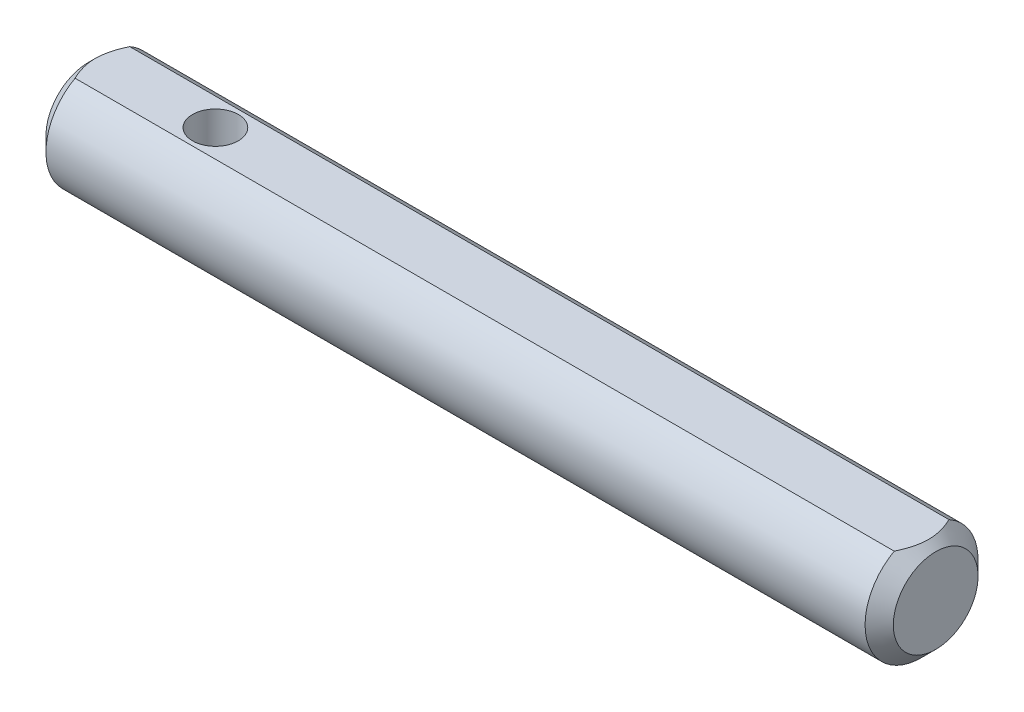
ISO-10303-21;
HEADER;
FILE_DESCRIPTION(('STEP AP214'),'2;1');
FILE_NAME('part.step','',(''),(''),'','','');
FILE_SCHEMA(('AUTOMOTIVE_DESIGN { 1 0 10303 214 1 1 1 1 }'));
ENDSEC;
DATA;
#1=APPLICATION_CONTEXT('core data for automotive mechanical design processes');
#2=APPLICATION_PROTOCOL_DEFINITION('international standard','automotive_design',2000,#1);
#3=PRODUCT_CONTEXT('',#1,'mechanical');
#4=PRODUCT('Part','Part','',(#3));
#5=PRODUCT_RELATED_PRODUCT_CATEGORY('part','',(#4));
#6=PRODUCT_DEFINITION_FORMATION('','',#4);
#7=PRODUCT_DEFINITION_CONTEXT('part definition',#1,'design');
#8=PRODUCT_DEFINITION('design','',#6,#7);
#9=PRODUCT_DEFINITION_SHAPE('','',#8);
#10=(LENGTH_UNIT() NAMED_UNIT(*) SI_UNIT(.MILLI.,.METRE.));
#11=(NAMED_UNIT(*) PLANE_ANGLE_UNIT() SI_UNIT($,.RADIAN.));
#12=(NAMED_UNIT(*) SI_UNIT($,.STERADIAN.) SOLID_ANGLE_UNIT());
#13=UNCERTAINTY_MEASURE_WITH_UNIT(LENGTH_MEASURE(1.E-05),#10,'distance_accuracy_value','');
#14=(GEOMETRIC_REPRESENTATION_CONTEXT(3) GLOBAL_UNCERTAINTY_ASSIGNED_CONTEXT((#13)) GLOBAL_UNIT_ASSIGNED_CONTEXT((#10,
#11,#12)) REPRESENTATION_CONTEXT('',''));
#15=CARTESIAN_POINT('',(0.,0.,0.));
#16=DIRECTION('',(0.,0.,1.));
#17=DIRECTION('',(1.,0.,0.));
#18=AXIS2_PLACEMENT_3D('',#15,#16,#17);
#19=CARTESIAN_POINT('',(0.,0.,0.));
#20=DIRECTION('',(-1.,0.,0.));
#21=DIRECTION('',(0.,0.,1.));
#22=AXIS2_PLACEMENT_3D('',#19,#20,#21);
#23=CYLINDRICAL_SURFACE('',#22,4.);
#24=CARTESIAN_POINT('',(7.379,-4.,0.));
#25=CARTESIAN_POINT('',(7.3790084709167,-3.99999370113856,0.0870320186558412));
#26=CARTESIAN_POINT('',(7.38605093021057,-3.99712633756395,0.174210824672569));
#27=CARTESIAN_POINT('',(7.41397506022112,-3.98593508707212,0.346106875857839));
#28=CARTESIAN_POINT('',(7.43489389409107,-3.97759654812493,0.430816871431102));
#29=CARTESIAN_POINT('',(7.48968051105506,-3.95636076011354,0.595010365655724));
#30=CARTESIAN_POINT('',(7.52350543293833,-3.94347861100514,0.674510154253167));
#31=CARTESIAN_POINT('',(7.60297187187898,-3.91441987890999,0.8266331820666));
#32=CARTESIAN_POINT('',(7.64860945069428,-3.89824439427686,0.899258702107213));
#33=CARTESIAN_POINT('',(7.75272442086819,-3.86335965586815,1.03917167012003));
#34=CARTESIAN_POINT('',(7.81167717203552,-3.84457038792506,1.10608528239249));
#35=CARTESIAN_POINT('',(7.93974521339987,-3.80693516928215,1.22939383681287));
#36=CARTESIAN_POINT('',(8.00886556044238,-3.78808919497459,1.2857835130451));
#37=CARTESIAN_POINT('',(8.15916174754786,-3.75150961007143,1.38899805382482));
#38=CARTESIAN_POINT('',(8.2407456020498,-3.73386690672284,1.43526433998784));
#39=CARTESIAN_POINT('',(8.41135845648328,-3.70295092416458,1.51325063216718));
#40=CARTESIAN_POINT('',(8.50038380180779,-3.68967551575113,1.54497772950294));
#41=CARTESIAN_POINT('',(8.67905415269273,-3.66985840305716,1.59146312685276));
#42=CARTESIAN_POINT('',(8.76848006981684,-3.66303366290068,1.60693836491954));
#43=CARTESIAN_POINT('',(8.94889976016228,-3.65607216657522,1.622719488306));
#44=CARTESIAN_POINT('',(9.03989271032802,-3.65593200054727,1.62303310769936));
#45=CARTESIAN_POINT('',(9.21389728217079,-3.6621146339964,1.60902436866541));
#46=CARTESIAN_POINT('',(9.29701302707375,-3.66797431078531,1.59575081358845));
#47=CARTESIAN_POINT('',(9.45971661091297,-3.68471742499501,1.55669653030339));
#48=CARTESIAN_POINT('',(9.5393038132473,-3.69560176493035,1.53091355514923));
#49=CARTESIAN_POINT('',(9.69464013103755,-3.72140913818774,1.46707734638714));
#50=CARTESIAN_POINT('',(9.7702757330756,-3.73641108986739,1.42878122476383));
#51=CARTESIAN_POINT('',(9.91433021039852,-3.7687426845307,1.34117668458775));
#52=CARTESIAN_POINT('',(9.9827463164524,-3.78607321495042,1.29186406280565));
#53=CARTESIAN_POINT('',(10.1161459480884,-3.822787407612,1.17901827948789));
#54=CARTESIAN_POINT('',(10.1804237289901,-3.84222473856345,1.11466605365711));
#55=CARTESIAN_POINT('',(10.2975043370995,-3.87979335897438,0.975892842843902));
#56=CARTESIAN_POINT('',(10.3503047572303,-3.89792437393614,0.901469751059882));
#57=CARTESIAN_POINT('',(10.4438913770252,-3.93131358707584,0.742621280819263));
#58=CARTESIAN_POINT('',(10.4844053752971,-3.94650432376356,0.658020314797222));
#59=CARTESIAN_POINT('',(10.5503818289753,-3.97178901414647,0.482431629140635));
#60=CARTESIAN_POINT('',(10.5758521395321,-3.9818856273662,0.391447270449383));
#61=CARTESIAN_POINT('',(10.6095754253524,-3.99535597813932,0.21158466476984));
#62=CARTESIAN_POINT('',(10.6187764256141,-3.99909933939547,0.122911774139392));
#63=CARTESIAN_POINT('',(10.6225076277042,-4.00061055006668,-0.0547818361238358));
#64=CARTESIAN_POINT('',(10.6170417572528,-3.99837999926807,-0.143802456261064));
#65=CARTESIAN_POINT('',(10.592285870102,-3.9884353232127,-0.315323337867602));
#66=CARTESIAN_POINT('',(10.5736487584109,-3.98098031771434,-0.397934522930635));
#67=CARTESIAN_POINT('',(10.5239741187384,-3.96160764151999,-0.558776777187741));
#68=CARTESIAN_POINT('',(10.4929350051632,-3.94968940021228,-0.637007284854263));
#69=CARTESIAN_POINT('',(10.4183231961572,-3.92208672478332,-0.789578302604575));
#70=CARTESIAN_POINT('',(10.3743942602122,-3.90629769763315,-0.863725074106403));
#71=CARTESIAN_POINT('',(10.2756437435599,-3.87265707941849,-1.00385694111079));
#72=CARTESIAN_POINT('',(10.2208177355534,-3.85480465126621,-1.06983870156734));
#73=CARTESIAN_POINT('',(10.0974777308164,-3.81747764005626,-1.19645858930197));
#74=CARTESIAN_POINT('',(10.0282881566518,-3.79797508335235,-1.2564321193414));
#75=CARTESIAN_POINT('',(9.88049202320751,-3.76065427524377,-1.36408733779214));
#76=CARTESIAN_POINT('',(9.80188374165842,-3.74283633295032,-1.41176677311199));
#77=CARTESIAN_POINT('',(9.63616476373893,-3.71084859753202,-1.49384527976585));
#78=CARTESIAN_POINT('',(9.54896974535191,-3.69672127331223,-1.52809184782424));
#79=CARTESIAN_POINT('',(9.36930288895524,-3.67434788820985,-1.58114268679275));
#80=CARTESIAN_POINT('',(9.2768351442949,-3.66609733041367,-1.59995876681562));
#81=CARTESIAN_POINT('',(9.09657735433696,-3.65707319749997,-1.62047202718813));
#82=CARTESIAN_POINT('',(9.0089435745299,-3.65579425480144,-1.62332667031381));
#83=CARTESIAN_POINT('',(8.83450496401628,-3.65952831903237,-1.61489130269439));
#84=CARTESIAN_POINT('',(8.74770002321055,-3.66454047822684,-1.60360319770522));
#85=CARTESIAN_POINT('',(8.58109537025206,-3.6798411004135,-1.56815670138821));
#86=CARTESIAN_POINT('',(8.50115447583515,-3.68990103468934,-1.54455412345482));
#87=CARTESIAN_POINT('',(8.34633940258973,-3.71399701680105,-1.48567584177924));
#88=CARTESIAN_POINT('',(8.27146663794379,-3.72803416879759,-1.45039689596979));
#89=CARTESIAN_POINT('',(8.12416355123188,-3.7595169070785,-1.36679755090399));
#90=CARTESIAN_POINT('',(8.05212892769901,-3.77711330691221,-1.31783768828588));
#91=CARTESIAN_POINT('',(7.91693492126193,-3.81328441947726,-1.20918869727205));
#92=CARTESIAN_POINT('',(7.85377835253593,-3.83185943985956,-1.14949618042817));
#93=CARTESIAN_POINT('',(7.73376861159738,-3.86939703855161,-1.01629881831761));
#94=CARTESIAN_POINT('',(7.67762557513451,-3.88830158744134,-0.942134821640311));
#95=CARTESIAN_POINT('',(7.5785603524431,-3.92309724122729,-0.784726009792763));
#96=CARTESIAN_POINT('',(7.53564426620323,-3.93898695445073,-0.701477028713342));
#97=CARTESIAN_POINT('',(7.46523606692227,-3.9657049743227,-0.529720718026334));
#98=CARTESIAN_POINT('',(7.43747966340747,-3.97661942037874,-0.441335346874398));
#99=CARTESIAN_POINT('',(7.39746222054256,-3.99251032861621,-0.260783866616663));
#100=CARTESIAN_POINT('',(7.3851522081207,-3.99750555497762,-0.16863066795006));
#101=CARTESIAN_POINT('',(7.37959512183408,-3.99975960183905,-0.0508279121486792));
#102=CARTESIAN_POINT('',(7.37899752582387,-4.0000018397646,-0.025420217295874));
#103=CARTESIAN_POINT('',(7.379,-4.,0.));
#104=B_SPLINE_CURVE_WITH_KNOTS('',3,(#24,#25,#26,#27,#28,#29,#30,#31,#32,#33,#34,#35,#36,#37,
#38,#39,#40,#41,#42,#43,#44,#45,#46,#47,#48,#49,#50,#51,#52,#53,#54,#55,#56,#57,#58,#59,#60,#61,
#62,#63,#64,#65,#66,#67,#68,#69,#70,#71,#72,#73,#74,#75,#76,#77,#78,#79,#80,#81,#82,#83,#84,#85,
#86,#87,#88,#89,#90,#91,#92,#93,#94,#95,#96,#97,#98,#99,#100,#101,#102,#103),.UNSPECIFIED.,.T.,
.F.,(4,2,2,2,2,2,2,2,2,2,2,2,2,2,2,2,2,2,2,2,2,2,2,2,2,2,2,2,2,2,2,2,2,2,2,2,2,2,2,4),(0.,
0.261026731168672,0.522755371459962,0.783622269729925,1.04440230890589,1.31662011995299,
1.58897377894471,1.87384234683106,2.15857182513464,2.43013261739596,2.70155488267048,
2.95349727140178,3.20548493086922,3.462687417082,3.71998820429596,3.99775245123561,
4.27557489589747,4.55916552855807,4.84260795147993,5.10891004963346,5.37514084043443,
5.62902415465945,5.88293993821511,6.14466798892222,6.40650259355438,6.68607109724752,
6.96569080002795,7.24839900278483,7.53089064357217,7.79260196875397,8.05427803174571,
8.30505179588833,8.55589524851991,8.8213363591109,9.08686142077596,9.37025385730284,
9.65377679351509,9.93218479865892,10.2097078571358,10.2859482607117),.UNSPECIFIED.);
#105=CARTESIAN_POINT('',(7.379,-4.,0.));
#106=VERTEX_POINT('',#105);
#107=EDGE_CURVE('E11',#106,#106,#104,.T.);
#108=ORIENTED_EDGE('',*,*,#107,.T.);
#109=EDGE_LOOP('',(#108));
#110=FACE_BOUND('',#109,.T.);
#111=DIRECTION('',(-1.,0.,0.));
#112=VECTOR('',#111,1.);
#113=CARTESIAN_POINT('',(60.,3.5,-1.93649167310371));
#114=LINE('',#113,#112);
#115=CARTESIAN_POINT('',(59.,3.5,-1.93649167310371));
#116=VERTEX_POINT('',#115);
#117=CARTESIAN_POINT('',(0.999999999999997,3.5,-1.93649167310371));
#118=VERTEX_POINT('',#117);
#119=EDGE_CURVE('E57',#116,#118,#114,.T.);
#120=ORIENTED_EDGE('',*,*,#119,.F.);
#121=CARTESIAN_POINT('',(59.,0.,0.));
#122=DIRECTION('',(-1.,0.,0.));
#123=DIRECTION('',(0.,0.,1.));
#124=AXIS2_PLACEMENT_3D('',#121,#122,#123);
#125=CIRCLE('',#124,4.);
#126=CARTESIAN_POINT('',(59.,3.5,1.93649167310371));
#127=VERTEX_POINT('',#126);
#128=EDGE_CURVE('E76',#116,#127,#125,.T.);
#129=ORIENTED_EDGE('',*,*,#128,.T.);
#130=DIRECTION('',(-1.,0.,0.));
#131=VECTOR('',#130,1.);
#132=CARTESIAN_POINT('',(60.,3.5,1.93649167310371));
#133=LINE('',#132,#131);
#134=CARTESIAN_POINT('',(0.999999999999998,3.5,1.93649167310371));
#135=VERTEX_POINT('',#134);
#136=EDGE_CURVE('E68',#127,#135,#133,.T.);
#137=ORIENTED_EDGE('',*,*,#136,.T.);
#138=CARTESIAN_POINT('',(0.999999999999997,0.,0.));
#139=DIRECTION('',(1.,0.,0.));
#140=DIRECTION('',(0.,0.,-1.));
#141=AXIS2_PLACEMENT_3D('',#138,#139,#140);
#142=CIRCLE('',#141,4.);
#143=EDGE_CURVE('E72',#135,#118,#142,.T.);
#144=ORIENTED_EDGE('',*,*,#143,.T.);
#145=EDGE_LOOP('',(#120,#129,#137,#144));
#146=FACE_BOUND('',#145,.T.);
#147=ADVANCED_FACE('F36',(#110,#146),#23,.T.);
#148=CARTESIAN_POINT('',(59.,0.,0.));
#149=DIRECTION('',(-1.,0.,0.));
#150=DIRECTION('',(0.,0.,1.));
#151=AXIS2_PLACEMENT_3D('',#148,#149,#150);
#152=CONICAL_SURFACE('',#151,4.,0.785398163397453);
#153=CARTESIAN_POINT('',(60.,0.,0.));
#154=DIRECTION('',(-1.,0.,0.));
#155=DIRECTION('',(0.,0.,1.));
#156=AXIS2_PLACEMENT_3D('',#153,#154,#155);
#157=CIRCLE('',#156,2.99999999999998);
#158=CARTESIAN_POINT('',(60.,0.,2.99999999999998));
#159=VERTEX_POINT('',#158);
#160=EDGE_CURVE('E81',#159,#159,#157,.F.);
#161=ORIENTED_EDGE('',*,*,#160,.F.);
#162=EDGE_LOOP('',(#161));
#163=FACE_BOUND('',#162,.T.);
#164=ORIENTED_EDGE('',*,*,#128,.F.);
#165=CARTESIAN_POINT('',(57.7709558684879,3.5,-3.88495849775789));
#166=CARTESIAN_POINT('',(57.8417265484128,3.5,-3.78968133342097));
#167=CARTESIAN_POINT('',(57.9117700859077,3.5,-3.69385487477238));
#168=CARTESIAN_POINT('',(58.0500827470864,3.5,-3.50089311100155));
#169=CARTESIAN_POINT('',(58.1183513990305,3.5,-3.4037574681252));
#170=CARTESIAN_POINT('',(58.2532777387966,3.5,-3.20725800739156));
#171=CARTESIAN_POINT('',(58.3199188270477,3.5,-3.10788275154328));
#172=CARTESIAN_POINT('',(58.4505691257804,3.5,-2.9074221143616));
#173=CARTESIAN_POINT('',(58.514578526729,3.5,-2.80633685753873));
#174=CARTESIAN_POINT('',(58.6426606488873,3.5,-2.59685083112692));
#175=CARTESIAN_POINT('',(58.7065611101521,3.5,-2.48834419748423));
#176=CARTESIAN_POINT('',(58.8299541722399,3.5,-2.26881604431261));
#177=CARTESIAN_POINT('',(58.8894461095311,3.5,-2.15779414947921));
#178=CARTESIAN_POINT('',(59.0027259557815,3.5,-1.93327831444896));
#179=CARTESIAN_POINT('',(59.0565306242001,3.5,-1.81979289704167));
#180=CARTESIAN_POINT('',(59.1572328785998,3.5,-1.58982274063077));
#181=CARTESIAN_POINT('',(59.2041334825552,3.5,-1.47333933845411));
#182=CARTESIAN_POINT('',(59.286625586855,3.5,-1.24488640020414));
#183=CARTESIAN_POINT('',(59.3227523498778,3.5,-1.13311221313747));
#184=CARTESIAN_POINT('',(59.3860160984175,3.5,-0.906999927508547));
#185=CARTESIAN_POINT('',(59.4131524219554,3.5,-0.79266164080946));
#186=CARTESIAN_POINT('',(59.4566050704741,3.5,-0.563937922529003));
#187=CARTESIAN_POINT('',(59.4730982320405,3.5,-0.449586630662137));
#188=CARTESIAN_POINT('',(59.4949670259913,3.5,-0.219820733556313));
#189=CARTESIAN_POINT('',(59.5003442947512,3.5,-0.104406287337796));
#190=CARTESIAN_POINT('',(59.4996324107891,3.5,0.122807086362571));
#191=CARTESIAN_POINT('',(59.4938932489384,3.5,0.234607277156871));
#192=CARTESIAN_POINT('',(59.4720065025215,3.5,0.457177594211726));
#193=CARTESIAN_POINT('',(59.4558578645048,3.5,0.567947615066862));
#194=CARTESIAN_POINT('',(59.4137330629687,3.5,0.789526981963795));
#195=CARTESIAN_POINT('',(59.3875944739594,3.5,0.90030497415093));
#196=CARTESIAN_POINT('',(59.3268401154052,3.5,1.11946317061426));
#197=CARTESIAN_POINT('',(59.2922252234764,3.5,1.22784362186023));
#198=CARTESIAN_POINT('',(59.2110957214907,3.5,1.45550446251121));
#199=CARTESIAN_POINT('',(59.1636324842805,3.5,1.57444371059339));
#200=CARTESIAN_POINT('',(59.0614691466232,3.5,1.80919998491854));
#201=CARTESIAN_POINT('',(59.0067655718902,3.5,1.92501547990332));
#202=CARTESIAN_POINT('',(58.8914282911648,3.5,2.15410976764526));
#203=CARTESIAN_POINT('',(58.8307756465661,3.5,2.26737894885683));
#204=CARTESIAN_POINT('',(58.7048864441279,3.5,2.49129904445812));
#205=CARTESIAN_POINT('',(58.6396506383727,3.5,2.60195038446327));
#206=CARTESIAN_POINT('',(58.5088754315312,3.5,2.81548535770493));
#207=CARTESIAN_POINT('',(58.4435161158833,3.5,2.91847986517973));
#208=CARTESIAN_POINT('',(58.3100853837603,3.5,3.12270257109735));
#209=CARTESIAN_POINT('',(58.2420137600848,3.5,3.22393063374408));
#210=CARTESIAN_POINT('',(58.1042146179663,3.5,3.42402444444311));
#211=CARTESIAN_POINT('',(58.034505292537,3.5,3.52290276638691));
#212=CARTESIAN_POINT('',(57.8932703201575,3.5,3.71931403126345));
#213=CARTESIAN_POINT('',(57.8217451761451,3.5,3.81684733542911));
#214=CARTESIAN_POINT('',(57.7494785915828,3.5,3.91381847563832));
#215=B_SPLINE_CURVE_WITH_KNOTS('',3,(#165,#166,#167,#168,#169,#170,#171,#172,#173,#174,#175,
#176,#177,#178,#179,#180,#181,#182,#183,#184,#185,#186,#187,#188,#189,#190,#191,#192,#193,#194,
#195,#196,#197,#198,#199,#200,#201,#202,#203,#204,#205,#206,#207,#208,#209,#210,#211,#212,#213,
#214),.UNSPECIFIED.,.F.,.F.,(4,2,2,2,2,2,2,2,2,2,2,2,2,2,2,2,2,2,2,2,2,2,2,2,4),(0.,
0.356063700307514,0.712221089425041,1.07114059459623,1.43003407724955,1.80772404165311,
2.1854707376047,2.56207127442207,2.93850669581966,3.29059437139964,3.64270796594243,
3.98880933268268,4.33485974605538,4.67019194132496,5.0055580779128,5.34662632483155,
5.68765927328184,6.07153500213987,6.45559560668381,6.84092119044736,7.22618369036808,
7.59208083740628,7.95800599009141,8.32092560301554,8.68374576965368),.UNSPECIFIED.);
#216=EDGE_CURVE('E66',#116,#127,#215,.T.);
#217=ORIENTED_EDGE('',*,*,#216,.T.);
#218=EDGE_LOOP('',(#164,#217));
#219=FACE_BOUND('',#218,.T.);
#220=ADVANCED_FACE('F80',(#163,#219),#152,.T.);
#221=CARTESIAN_POINT('',(0.,0.,0.));
#222=DIRECTION('',(1.,0.,0.));
#223=DIRECTION('',(0.,0.,-1.));
#224=AXIS2_PLACEMENT_3D('',#221,#222,#223);
#225=CONICAL_SURFACE('',#224,3.,0.785398163397448);
#226=CARTESIAN_POINT('',(0.,0.,0.));
#227=DIRECTION('',(1.,0.,0.));
#228=DIRECTION('',(0.,0.,-1.));
#229=AXIS2_PLACEMENT_3D('',#226,#227,#228);
#230=CIRCLE('',#229,3.);
#231=CARTESIAN_POINT('',(0.,0.,-3.));
#232=VERTEX_POINT('',#231);
#233=EDGE_CURVE('E84',#232,#232,#230,.F.);
#234=ORIENTED_EDGE('',*,*,#233,.F.);
#235=EDGE_LOOP('',(#234));
#236=FACE_BOUND('',#235,.T.);
#237=ORIENTED_EDGE('',*,*,#143,.F.);
#238=CARTESIAN_POINT('',(2.2290441315121,3.5,-3.88495849775788));
#239=CARTESIAN_POINT('',(2.15827345158719,3.5,-3.78968133342096));
#240=CARTESIAN_POINT('',(2.08822991409228,3.5,-3.69385487477237));
#241=CARTESIAN_POINT('',(1.94991725291355,3.5,-3.50089311100154));
#242=CARTESIAN_POINT('',(1.88164860096952,3.5,-3.40375746812519));
#243=CARTESIAN_POINT('',(1.74672226120336,3.5,-3.20725800739155));
#244=CARTESIAN_POINT('',(1.68008117295225,3.5,-3.10788275154327));
#245=CARTESIAN_POINT('',(1.5494308742196,3.5,-2.90742211436159));
#246=CARTESIAN_POINT('',(1.48542147327096,3.5,-2.80633685753872));
#247=CARTESIAN_POINT('',(1.35733935111272,3.5,-2.59685083112692));
#248=CARTESIAN_POINT('',(1.2934388898479,3.5,-2.48834419748423));
#249=CARTESIAN_POINT('',(1.17004582776012,3.5,-2.26881604431261));
#250=CARTESIAN_POINT('',(1.11055389046886,3.5,-2.1577941494792));
#251=CARTESIAN_POINT('',(0.997274044218509,3.5,-1.93327831444896));
#252=CARTESIAN_POINT('',(0.943469375799861,3.5,-1.81979289704167));
#253=CARTESIAN_POINT('',(0.842767121400184,3.5,-1.58982274063077));
#254=CARTESIAN_POINT('',(0.79586651744482,3.5,-1.47333933845411));
#255=CARTESIAN_POINT('',(0.713374413144944,3.5,-1.24488640020414));
#256=CARTESIAN_POINT('',(0.677247650122185,3.5,-1.13311221313747));
#257=CARTESIAN_POINT('',(0.613983901582522,3.5,-0.906999927508553));
#258=CARTESIAN_POINT('',(0.586847578044597,3.5,-0.792661640809466));
#259=CARTESIAN_POINT('',(0.543394929525925,3.5,-0.563937922529013));
#260=CARTESIAN_POINT('',(0.526901767959499,3.5,-0.449586630662149));
#261=CARTESIAN_POINT('',(0.505032974008709,3.5,-0.219820733556328));
#262=CARTESIAN_POINT('',(0.499655705248752,3.5,-0.104406287337813));
#263=CARTESIAN_POINT('',(0.500367589210898,3.5,0.122807086362552));
#264=CARTESIAN_POINT('',(0.506106751061529,3.5,0.234607277156851));
#265=CARTESIAN_POINT('',(0.527993497478423,3.5,0.457177594211705));
#266=CARTESIAN_POINT('',(0.544142135495195,3.5,0.56794761506684));
#267=CARTESIAN_POINT('',(0.586266937031272,3.5,0.789526981963772));
#268=CARTESIAN_POINT('',(0.612405526040557,3.5,0.900304974150905));
#269=CARTESIAN_POINT('',(0.673159884594753,3.5,1.11946317061423));
#270=CARTESIAN_POINT('',(0.707774776523582,3.5,1.2278436218602));
#271=CARTESIAN_POINT('',(0.78890427850927,3.5,1.45550446251118));
#272=CARTESIAN_POINT('',(0.836367515719506,3.5,1.57444371059335));
#273=CARTESIAN_POINT('',(0.938530853376747,3.5,1.8091999849185));
#274=CARTESIAN_POINT('',(0.993234428109792,3.5,1.92501547990327));
#275=CARTESIAN_POINT('',(1.10857170883512,3.5,2.15410976764521));
#276=CARTESIAN_POINT('',(1.1692243534339,3.5,2.26737894885677));
#277=CARTESIAN_POINT('',(1.29511355587206,3.5,2.49129904445806));
#278=CARTESIAN_POINT('',(1.36034936162728,3.5,2.60195038446321));
#279=CARTESIAN_POINT('',(1.49112456846872,3.5,2.81548535770486));
#280=CARTESIAN_POINT('',(1.55648388411662,3.5,2.91847986517966));
#281=CARTESIAN_POINT('',(1.68991461623964,3.5,3.12270257109727));
#282=CARTESIAN_POINT('',(1.75798623991517,3.5,3.223930633744));
#283=CARTESIAN_POINT('',(1.89578538203361,3.5,3.42402444444303));
#284=CARTESIAN_POINT('',(1.96549470746292,3.5,3.52290276638682));
#285=CARTESIAN_POINT('',(2.10672967984244,3.5,3.71931403126335));
#286=CARTESIAN_POINT('',(2.17825482385479,3.5,3.81684733542901));
#287=CARTESIAN_POINT('',(2.25052140841717,3.5,3.91381847563822));
#288=B_SPLINE_CURVE_WITH_KNOTS('',3,(#238,#239,#240,#241,#242,#243,#244,#245,#246,#247,#248,
#249,#250,#251,#252,#253,#254,#255,#256,#257,#258,#259,#260,#261,#262,#263,#264,#265,#266,#267,
#268,#269,#270,#271,#272,#273,#274,#275,#276,#277,#278,#279,#280,#281,#282,#283,#284,#285,#286,
#287),.UNSPECIFIED.,.F.,.F.,(4,2,2,2,2,2,2,2,2,2,2,2,2,2,2,2,2,2,2,2,2,2,2,2,4),(0.,
0.356063700307517,0.712221089425044,1.07114059459623,1.43003407724955,1.80772404165311,
2.18547073760469,2.56207127442207,2.93850669581966,3.29059437139963,3.64270796594241,
3.98880933268266,4.33485974605535,4.67019194132493,5.00555807791277,5.34662632483152,
5.6876592732818,6.07153500213982,6.45559560668375,6.8409211904473,7.226183690368,
7.59208083740619,7.95800599009131,8.32092560301543,8.68374576965355),.UNSPECIFIED.);
#289=EDGE_CURVE('E50',#135,#118,#288,.F.);
#290=ORIENTED_EDGE('',*,*,#289,.T.);
#291=EDGE_LOOP('',(#237,#290));
#292=FACE_BOUND('',#291,.T.);
#293=ADVANCED_FACE('F38',(#236,#292),#225,.T.);
#294=CARTESIAN_POINT('',(0.,0.,0.));
#295=DIRECTION('',(1.,0.,0.));
#296=DIRECTION('',(0.,0.,-1.));
#297=AXIS2_PLACEMENT_3D('',#294,#295,#296);
#298=PLANE('',#297);
#299=ORIENTED_EDGE('',*,*,#233,.T.);
#300=EDGE_LOOP('',(#299));
#301=FACE_BOUND('',#300,.T.);
#302=ADVANCED_FACE('F111',(#301),#298,.F.);
#303=CARTESIAN_POINT('',(60.,0.,0.));
#304=DIRECTION('',(-1.,0.,0.));
#305=DIRECTION('',(0.,0.,1.));
#306=AXIS2_PLACEMENT_3D('',#303,#304,#305);
#307=PLANE('',#306);
#308=ORIENTED_EDGE('',*,*,#160,.T.);
#309=EDGE_LOOP('',(#308));
#310=FACE_BOUND('',#309,.T.);
#311=ADVANCED_FACE('F98',(#310),#307,.F.);
#312=CARTESIAN_POINT('',(60.,3.5,1.93649167310371));
#313=DIRECTION('',(0.,1.,0.));
#314=DIRECTION('',(0.,0.,1.));
#315=AXIS2_PLACEMENT_3D('',#312,#313,#314);
#316=PLANE('',#315);
#317=CARTESIAN_POINT('',(9.,3.5,0.));
#318=DIRECTION('',(0.,1.,0.));
#319=DIRECTION('',(0.,0.,1.));
#320=AXIS2_PLACEMENT_3D('',#317,#318,#319);
#321=CIRCLE('',#320,1.621);
#322=CARTESIAN_POINT('',(9.,3.5,1.621));
#323=VERTEX_POINT('',#322);
#324=EDGE_CURVE('E78',#323,#323,#321,.T.);
#325=ORIENTED_EDGE('',*,*,#324,.F.);
#326=EDGE_LOOP('',(#325));
#327=FACE_BOUND('',#326,.T.);
#328=ORIENTED_EDGE('',*,*,#119,.T.);
#329=ORIENTED_EDGE('',*,*,#289,.F.);
#330=ORIENTED_EDGE('',*,*,#136,.F.);
#331=ORIENTED_EDGE('',*,*,#216,.F.);
#332=EDGE_LOOP('',(#328,#329,#330,#331));
#333=FACE_BOUND('',#332,.T.);
#334=ADVANCED_FACE('F67',(#327,#333),#316,.T.);
#335=CARTESIAN_POINT('',(9.,3.5,0.));
#336=DIRECTION('',(0.,1.,0.));
#337=DIRECTION('',(0.,0.,1.));
#338=AXIS2_PLACEMENT_3D('',#335,#336,#337);
#339=CYLINDRICAL_SURFACE('',#338,1.621);
#340=ORIENTED_EDGE('',*,*,#324,.T.);
#341=EDGE_LOOP('',(#340));
#342=FACE_BOUND('',#341,.T.);
#343=ORIENTED_EDGE('',*,*,#107,.F.);
#344=EDGE_LOOP('',(#343));
#345=FACE_BOUND('',#344,.T.);
#346=ADVANCED_FACE('F97',(#342,#345),#339,.F.);
#347=CLOSED_SHELL('',(#147,#220,#293,#302,#311,#334,#346));
#348=MANIFOLD_SOLID_BREP('B2',#347);
#349=ADVANCED_BREP_SHAPE_REPRESENTATION('',(#18,#348),#14);
#350=SHAPE_DEFINITION_REPRESENTATION(#9,#349);
ENDSEC;
END-ISO-10303-21;
